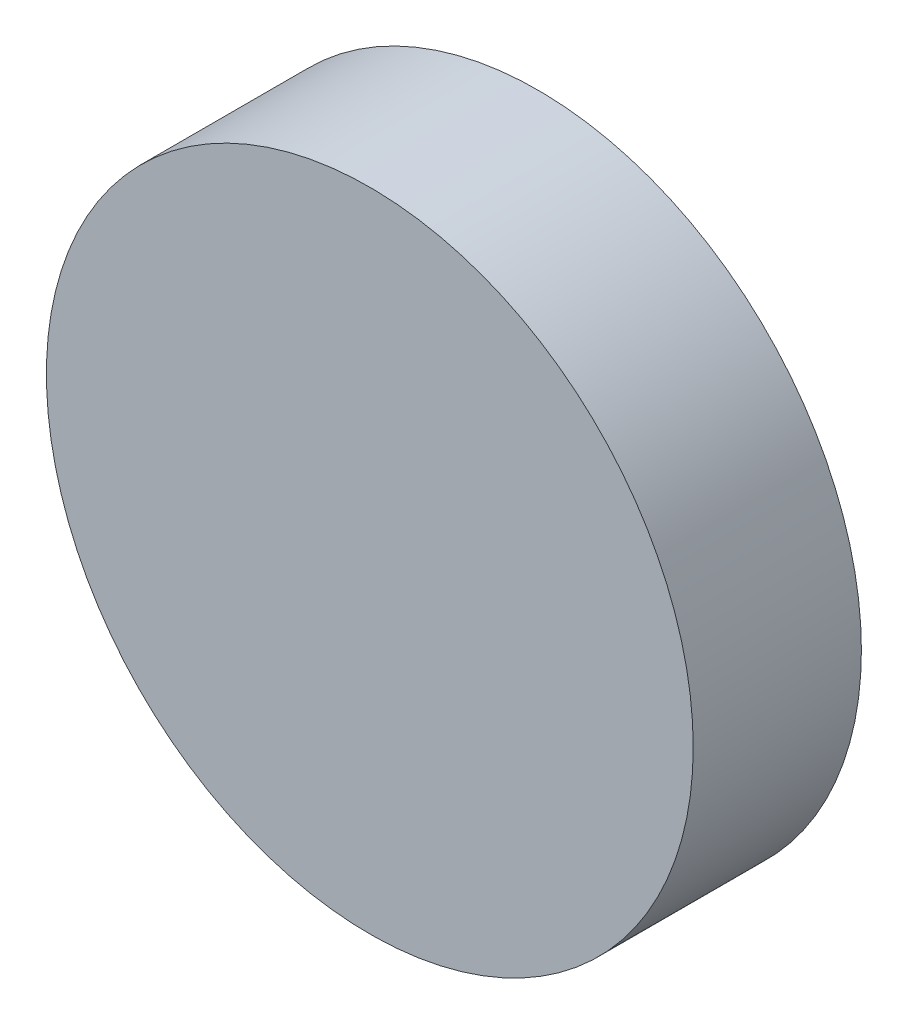
ISO-10303-21;
HEADER;
FILE_DESCRIPTION(('STEP AP214'),'2;1');
FILE_NAME('part.step','',(''),(''),'','','');
FILE_SCHEMA(('AUTOMOTIVE_DESIGN { 1 0 10303 214 1 1 1 1 }'));
ENDSEC;
DATA;
#1=APPLICATION_CONTEXT('core data for automotive mechanical design processes');
#2=APPLICATION_PROTOCOL_DEFINITION('international standard','automotive_design',2000,#1);
#3=PRODUCT_CONTEXT('',#1,'mechanical');
#4=PRODUCT('Part','Part','',(#3));
#5=PRODUCT_RELATED_PRODUCT_CATEGORY('part','',(#4));
#6=PRODUCT_DEFINITION_FORMATION('','',#4);
#7=PRODUCT_DEFINITION_CONTEXT('part definition',#1,'design');
#8=PRODUCT_DEFINITION('design','',#6,#7);
#9=PRODUCT_DEFINITION_SHAPE('','',#8);
#10=(LENGTH_UNIT() NAMED_UNIT(*) SI_UNIT(.MILLI.,.METRE.));
#11=(NAMED_UNIT(*) PLANE_ANGLE_UNIT() SI_UNIT($,.RADIAN.));
#12=(NAMED_UNIT(*) SI_UNIT($,.STERADIAN.) SOLID_ANGLE_UNIT());
#13=UNCERTAINTY_MEASURE_WITH_UNIT(LENGTH_MEASURE(1.E-05),#10,'distance_accuracy_value','');
#14=(GEOMETRIC_REPRESENTATION_CONTEXT(3) GLOBAL_UNCERTAINTY_ASSIGNED_CONTEXT((#13)) GLOBAL_UNIT_ASSIGNED_CONTEXT((#10,
#11,#12)) REPRESENTATION_CONTEXT('',''));
#15=CARTESIAN_POINT('',(0.,0.,0.));
#16=DIRECTION('',(0.,0.,1.));
#17=DIRECTION('',(1.,0.,0.));
#18=AXIS2_PLACEMENT_3D('',#15,#16,#17);
#19=CARTESIAN_POINT('',(0.,0.,26.));
#20=DIRECTION('',(0.,0.,-1.));
#21=DIRECTION('',(-1.,0.,0.));
#22=AXIS2_PLACEMENT_3D('',#19,#20,#21);
#23=CYLINDRICAL_SURFACE('',#22,50.);
#24=CARTESIAN_POINT('',(0.,0.,26.));
#25=DIRECTION('',(0.,0.,1.));
#26=DIRECTION('',(1.,0.,0.));
#27=AXIS2_PLACEMENT_3D('',#24,#25,#26);
#28=CIRCLE('',#27,50.);
#29=CARTESIAN_POINT('',(50.,0.,26.));
#30=VERTEX_POINT('',#29);
#31=EDGE_CURVE('E10',#30,#30,#28,.T.);
#32=ORIENTED_EDGE('',*,*,#31,.F.);
#33=EDGE_LOOP('',(#32));
#34=FACE_BOUND('',#33,.T.);
#35=CARTESIAN_POINT('',(0.,0.,0.));
#36=DIRECTION('',(0.,0.,1.));
#37=DIRECTION('',(1.,0.,0.));
#38=AXIS2_PLACEMENT_3D('',#35,#36,#37);
#39=CIRCLE('',#38,50.);
#40=CARTESIAN_POINT('',(50.,0.,0.));
#41=VERTEX_POINT('',#40);
#42=EDGE_CURVE('E37',#41,#41,#39,.T.);
#43=ORIENTED_EDGE('',*,*,#42,.T.);
#44=EDGE_LOOP('',(#43));
#45=FACE_BOUND('',#44,.T.);
#46=ADVANCED_FACE('F40',(#34,#45),#23,.T.);
#47=CARTESIAN_POINT('',(0.,0.,26.));
#48=DIRECTION('',(0.,0.,1.));
#49=DIRECTION('',(1.,0.,0.));
#50=AXIS2_PLACEMENT_3D('',#47,#48,#49);
#51=PLANE('',#50);
#52=ORIENTED_EDGE('',*,*,#31,.T.);
#53=EDGE_LOOP('',(#52));
#54=FACE_BOUND('',#53,.T.);
#55=ADVANCED_FACE('F55',(#54),#51,.T.);
#56=CARTESIAN_POINT('',(0.,0.,0.));
#57=DIRECTION('',(0.,0.,1.));
#58=DIRECTION('',(1.,0.,0.));
#59=AXIS2_PLACEMENT_3D('',#56,#57,#58);
#60=PLANE('',#59);
#61=ORIENTED_EDGE('',*,*,#42,.F.);
#62=EDGE_LOOP('',(#61));
#63=FACE_BOUND('',#62,.T.);
#64=ADVANCED_FACE('F49',(#63),#60,.F.);
#65=CLOSED_SHELL('',(#46,#55,#64));
#66=MANIFOLD_SOLID_BREP('B2',#65);
#67=ADVANCED_BREP_SHAPE_REPRESENTATION('',(#18,#66),#14);
#68=SHAPE_DEFINITION_REPRESENTATION(#9,#67);
ENDSEC;
END-ISO-10303-21;
